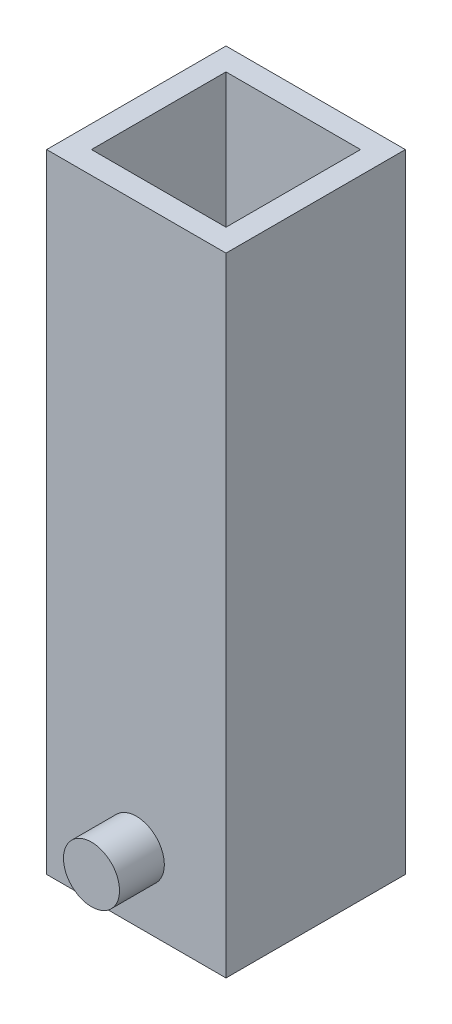
ISO-10303-21;
HEADER;
FILE_DESCRIPTION(('STEP AP214'),'2;1');
FILE_NAME('part.step','',(''),(''),'','','');
FILE_SCHEMA(('AUTOMOTIVE_DESIGN { 1 0 10303 214 1 1 1 1 }'));
ENDSEC;
DATA;
#1=APPLICATION_CONTEXT('core data for automotive mechanical design processes');
#2=APPLICATION_PROTOCOL_DEFINITION('international standard','automotive_design',2000,#1);
#3=PRODUCT_CONTEXT('',#1,'mechanical');
#4=PRODUCT('Part','Part','',(#3));
#5=PRODUCT_RELATED_PRODUCT_CATEGORY('part','',(#4));
#6=PRODUCT_DEFINITION_FORMATION('','',#4);
#7=PRODUCT_DEFINITION_CONTEXT('part definition',#1,'design');
#8=PRODUCT_DEFINITION('design','',#6,#7);
#9=PRODUCT_DEFINITION_SHAPE('','',#8);
#10=(LENGTH_UNIT() NAMED_UNIT(*) SI_UNIT(.MILLI.,.METRE.));
#11=(NAMED_UNIT(*) PLANE_ANGLE_UNIT() SI_UNIT($,.RADIAN.));
#12=(NAMED_UNIT(*) SI_UNIT($,.STERADIAN.) SOLID_ANGLE_UNIT());
#13=UNCERTAINTY_MEASURE_WITH_UNIT(LENGTH_MEASURE(1.E-05),#10,'distance_accuracy_value','');
#14=(GEOMETRIC_REPRESENTATION_CONTEXT(3) GLOBAL_UNCERTAINTY_ASSIGNED_CONTEXT((#13)) GLOBAL_UNIT_ASSIGNED_CONTEXT((#10,
#11,#12)) REPRESENTATION_CONTEXT('',''));
#15=CARTESIAN_POINT('',(0.,0.,0.));
#16=DIRECTION('',(0.,0.,1.));
#17=DIRECTION('',(1.,0.,0.));
#18=AXIS2_PLACEMENT_3D('',#15,#16,#17);
#19=CARTESIAN_POINT('',(40.,-30.,-40.));
#20=DIRECTION('',(1.,0.,0.));
#21=DIRECTION('',(0.,0.,-1.));
#22=AXIS2_PLACEMENT_3D('',#19,#20,#21);
#23=PLANE('',#22);
#24=DIRECTION('',(0.,1.,0.));
#25=VECTOR('',#24,1.);
#26=CARTESIAN_POINT('',(40.,-30.,-40.));
#27=LINE('',#26,#25);
#28=CARTESIAN_POINT('',(40.,-30.,-40.));
#29=VERTEX_POINT('',#28);
#30=CARTESIAN_POINT('',(40.,250.,-40.));
#31=VERTEX_POINT('',#30);
#32=EDGE_CURVE('E42',#29,#31,#27,.T.);
#33=ORIENTED_EDGE('',*,*,#32,.T.);
#34=DIRECTION('',(0.,0.,-1.));
#35=VECTOR('',#34,1.);
#36=CARTESIAN_POINT('',(40.,250.,-40.));
#37=LINE('',#36,#35);
#38=CARTESIAN_POINT('',(40.,250.,40.));
#39=VERTEX_POINT('',#38);
#40=EDGE_CURVE('E144',#39,#31,#37,.T.);
#41=ORIENTED_EDGE('',*,*,#40,.F.);
#42=DIRECTION('',(0.,1.,0.));
#43=VECTOR('',#42,1.);
#44=CARTESIAN_POINT('',(40.,-30.,40.));
#45=LINE('',#44,#43);
#46=CARTESIAN_POINT('',(40.,-30.,40.));
#47=VERTEX_POINT('',#46);
#48=EDGE_CURVE('E11',#47,#39,#45,.T.);
#49=ORIENTED_EDGE('',*,*,#48,.F.);
#50=DIRECTION('',(0.,0.,-1.));
#51=VECTOR('',#50,1.);
#52=CARTESIAN_POINT('',(40.,-30.,-40.));
#53=LINE('',#52,#51);
#54=EDGE_CURVE('E171',#47,#29,#53,.T.);
#55=ORIENTED_EDGE('',*,*,#54,.T.);
#56=EDGE_LOOP('',(#33,#41,#49,#55));
#57=FACE_BOUND('',#56,.T.);
#58=ADVANCED_FACE('F39',(#57),#23,.T.);
#59=CARTESIAN_POINT('',(-40.,-30.,40.));
#60=DIRECTION('',(0.,0.,1.));
#61=DIRECTION('',(1.,0.,0.));
#62=AXIS2_PLACEMENT_3D('',#59,#60,#61);
#63=PLANE('',#62);
#64=CARTESIAN_POINT('',(0.,0.,40.));
#65=DIRECTION('',(0.,0.,1.));
#66=DIRECTION('',(1.,0.,0.));
#67=AXIS2_PLACEMENT_3D('',#64,#65,#66);
#68=CIRCLE('',#67,12.5);
#69=CARTESIAN_POINT('',(12.5,0.,40.));
#70=VERTEX_POINT('',#69);
#71=EDGE_CURVE('E352',#70,#70,#68,.T.);
#72=ORIENTED_EDGE('',*,*,#71,.F.);
#73=EDGE_LOOP('',(#72));
#74=FACE_BOUND('',#73,.T.);
#75=ORIENTED_EDGE('',*,*,#48,.T.);
#76=DIRECTION('',(1.,0.,0.));
#77=VECTOR('',#76,1.);
#78=CARTESIAN_POINT('',(-40.,250.,40.));
#79=LINE('',#78,#77);
#80=CARTESIAN_POINT('',(-40.,250.,40.));
#81=VERTEX_POINT('',#80);
#82=EDGE_CURVE('E155',#81,#39,#79,.T.);
#83=ORIENTED_EDGE('',*,*,#82,.F.);
#84=DIRECTION('',(0.,1.,0.));
#85=VECTOR('',#84,1.);
#86=CARTESIAN_POINT('',(-40.,-30.,40.));
#87=LINE('',#86,#85);
#88=CARTESIAN_POINT('',(-40.,-30.,40.));
#89=VERTEX_POINT('',#88);
#90=EDGE_CURVE('E48',#89,#81,#87,.T.);
#91=ORIENTED_EDGE('',*,*,#90,.F.);
#92=DIRECTION('',(1.,0.,0.));
#93=VECTOR('',#92,1.);
#94=CARTESIAN_POINT('',(-40.,-30.,40.));
#95=LINE('',#94,#93);
#96=EDGE_CURVE('E187',#89,#47,#95,.T.);
#97=ORIENTED_EDGE('',*,*,#96,.T.);
#98=EDGE_LOOP('',(#75,#83,#91,#97));
#99=FACE_BOUND('',#98,.T.);
#100=ADVANCED_FACE('F203',(#74,#99),#63,.T.);
#101=CARTESIAN_POINT('',(-40.,-30.,-40.));
#102=DIRECTION('',(-1.,0.,0.));
#103=DIRECTION('',(0.,0.,1.));
#104=AXIS2_PLACEMENT_3D('',#101,#102,#103);
#105=PLANE('',#104);
#106=ORIENTED_EDGE('',*,*,#90,.T.);
#107=DIRECTION('',(0.,0.,1.));
#108=VECTOR('',#107,1.);
#109=CARTESIAN_POINT('',(-40.,250.,-40.));
#110=LINE('',#109,#108);
#111=CARTESIAN_POINT('',(-40.,250.,-40.));
#112=VERTEX_POINT('',#111);
#113=EDGE_CURVE('E151',#112,#81,#110,.T.);
#114=ORIENTED_EDGE('',*,*,#113,.F.);
#115=DIRECTION('',(0.,1.,0.));
#116=VECTOR('',#115,1.);
#117=CARTESIAN_POINT('',(-40.,-30.,-40.));
#118=LINE('',#117,#116);
#119=CARTESIAN_POINT('',(-40.,-30.,-40.));
#120=VERTEX_POINT('',#119);
#121=EDGE_CURVE('E192',#120,#112,#118,.T.);
#122=ORIENTED_EDGE('',*,*,#121,.F.);
#123=DIRECTION('',(0.,0.,1.));
#124=VECTOR('',#123,1.);
#125=CARTESIAN_POINT('',(-40.,-30.,-40.));
#126=LINE('',#125,#124);
#127=EDGE_CURVE('E183',#120,#89,#126,.T.);
#128=ORIENTED_EDGE('',*,*,#127,.T.);
#129=EDGE_LOOP('',(#106,#114,#122,#128));
#130=FACE_BOUND('',#129,.T.);
#131=ADVANCED_FACE('F209',(#130),#105,.T.);
#132=CARTESIAN_POINT('',(-40.,-30.,-40.));
#133=DIRECTION('',(0.,0.,-1.));
#134=DIRECTION('',(-1.,0.,0.));
#135=AXIS2_PLACEMENT_3D('',#132,#133,#134);
#136=PLANE('',#135);
#137=CARTESIAN_POINT('',(0.,0.,-40.));
#138=DIRECTION('',(0.,0.,-1.));
#139=DIRECTION('',(-1.,0.,0.));
#140=AXIS2_PLACEMENT_3D('',#137,#138,#139);
#141=CIRCLE('',#140,12.5);
#142=CARTESIAN_POINT('',(-12.5,0.,-40.));
#143=VERTEX_POINT('',#142);
#144=EDGE_CURVE('E353',#143,#143,#141,.T.);
#145=ORIENTED_EDGE('',*,*,#144,.F.);
#146=EDGE_LOOP('',(#145));
#147=FACE_BOUND('',#146,.T.);
#148=ORIENTED_EDGE('',*,*,#121,.T.);
#149=DIRECTION('',(-1.,0.,0.));
#150=VECTOR('',#149,1.);
#151=CARTESIAN_POINT('',(-40.,250.,-40.));
#152=LINE('',#151,#150);
#153=EDGE_CURVE('E147',#31,#112,#152,.T.);
#154=ORIENTED_EDGE('',*,*,#153,.F.);
#155=ORIENTED_EDGE('',*,*,#32,.F.);
#156=DIRECTION('',(-1.,0.,0.));
#157=VECTOR('',#156,1.);
#158=CARTESIAN_POINT('',(-40.,-30.,-40.));
#159=LINE('',#158,#157);
#160=EDGE_CURVE('E179',#29,#120,#159,.T.);
#161=ORIENTED_EDGE('',*,*,#160,.T.);
#162=EDGE_LOOP('',(#148,#154,#155,#161));
#163=FACE_BOUND('',#162,.T.);
#164=ADVANCED_FACE('F198',(#147,#163),#136,.T.);
#165=CARTESIAN_POINT('',(0.,-30.,0.));
#166=DIRECTION('',(0.,1.,0.));
#167=DIRECTION('',(0.,0.,1.));
#168=AXIS2_PLACEMENT_3D('',#165,#166,#167);
#169=PLANE('',#168);
#170=DIRECTION('',(1.,0.,0.));
#171=VECTOR('',#170,1.);
#172=CARTESIAN_POINT('',(-30.,-30.,30.));
#173=LINE('',#172,#171);
#174=CARTESIAN_POINT('',(-30.,-30.,30.));
#175=VERTEX_POINT('',#174);
#176=CARTESIAN_POINT('',(30.,-30.,30.));
#177=VERTEX_POINT('',#176);
#178=EDGE_CURVE('E118',#175,#177,#173,.T.);
#179=ORIENTED_EDGE('',*,*,#178,.T.);
#180=DIRECTION('',(0.,0.,-1.));
#181=VECTOR('',#180,1.);
#182=CARTESIAN_POINT('',(30.,-30.,-30.));
#183=LINE('',#182,#181);
#184=CARTESIAN_POINT('',(30.,-30.,-30.));
#185=VERTEX_POINT('',#184);
#186=EDGE_CURVE('E159',#177,#185,#183,.T.);
#187=ORIENTED_EDGE('',*,*,#186,.T.);
#188=DIRECTION('',(-1.,0.,0.));
#189=VECTOR('',#188,1.);
#190=CARTESIAN_POINT('',(-30.,-30.,-30.));
#191=LINE('',#190,#189);
#192=CARTESIAN_POINT('',(-30.,-30.,-30.));
#193=VERTEX_POINT('',#192);
#194=EDGE_CURVE('E112',#185,#193,#191,.T.);
#195=ORIENTED_EDGE('',*,*,#194,.T.);
#196=DIRECTION('',(0.,0.,1.));
#197=VECTOR('',#196,1.);
#198=CARTESIAN_POINT('',(-30.,-30.,-30.));
#199=LINE('',#198,#197);
#200=EDGE_CURVE('E56',#193,#175,#199,.T.);
#201=ORIENTED_EDGE('',*,*,#200,.T.);
#202=EDGE_LOOP('',(#179,#187,#195,#201));
#203=FACE_BOUND('',#202,.T.);
#204=ORIENTED_EDGE('',*,*,#54,.F.);
#205=ORIENTED_EDGE('',*,*,#96,.F.);
#206=ORIENTED_EDGE('',*,*,#127,.F.);
#207=ORIENTED_EDGE('',*,*,#160,.F.);
#208=EDGE_LOOP('',(#204,#205,#206,#207));
#209=FACE_BOUND('',#208,.T.);
#210=ADVANCED_FACE('F207',(#203,#209),#169,.F.);
#211=CARTESIAN_POINT('',(30.,-30.,-30.));
#212=DIRECTION('',(1.,0.,0.));
#213=DIRECTION('',(0.,0.,-1.));
#214=AXIS2_PLACEMENT_3D('',#211,#212,#213);
#215=PLANE('',#214);
#216=DIRECTION('',(0.,1.,0.));
#217=VECTOR('',#216,1.);
#218=CARTESIAN_POINT('',(30.,-30.,30.));
#219=LINE('',#218,#217);
#220=CARTESIAN_POINT('',(30.,250.,30.));
#221=VERTEX_POINT('',#220);
#222=EDGE_CURVE('E123',#177,#221,#219,.T.);
#223=ORIENTED_EDGE('',*,*,#222,.T.);
#224=DIRECTION('',(0.,0.,-1.));
#225=VECTOR('',#224,1.);
#226=CARTESIAN_POINT('',(30.,250.,-30.));
#227=LINE('',#226,#225);
#228=CARTESIAN_POINT('',(30.,250.,-30.));
#229=VERTEX_POINT('',#228);
#230=EDGE_CURVE('E121',#221,#229,#227,.T.);
#231=ORIENTED_EDGE('',*,*,#230,.T.);
#232=DIRECTION('',(0.,1.,0.));
#233=VECTOR('',#232,1.);
#234=CARTESIAN_POINT('',(30.,-30.,-30.));
#235=LINE('',#234,#233);
#236=EDGE_CURVE('E105',#185,#229,#235,.T.);
#237=ORIENTED_EDGE('',*,*,#236,.F.);
#238=ORIENTED_EDGE('',*,*,#186,.F.);
#239=EDGE_LOOP('',(#223,#231,#237,#238));
#240=FACE_BOUND('',#239,.T.);
#241=ADVANCED_FACE('F122',(#240),#215,.F.);
#242=CARTESIAN_POINT('',(-30.,-30.,30.));
#243=DIRECTION('',(0.,0.,1.));
#244=DIRECTION('',(1.,0.,0.));
#245=AXIS2_PLACEMENT_3D('',#242,#243,#244);
#246=PLANE('',#245);
#247=DIRECTION('',(0.,1.,0.));
#248=VECTOR('',#247,1.);
#249=CARTESIAN_POINT('',(-30.,-30.,30.));
#250=LINE('',#249,#248);
#251=CARTESIAN_POINT('',(-30.,250.,30.));
#252=VERTEX_POINT('',#251);
#253=EDGE_CURVE('E172',#175,#252,#250,.T.);
#254=ORIENTED_EDGE('',*,*,#253,.T.);
#255=DIRECTION('',(1.,0.,0.));
#256=VECTOR('',#255,1.);
#257=CARTESIAN_POINT('',(-30.,250.,30.));
#258=LINE('',#257,#256);
#259=EDGE_CURVE('E138',#252,#221,#258,.T.);
#260=ORIENTED_EDGE('',*,*,#259,.T.);
#261=ORIENTED_EDGE('',*,*,#222,.F.);
#262=ORIENTED_EDGE('',*,*,#178,.F.);
#263=EDGE_LOOP('',(#254,#260,#261,#262));
#264=FACE_BOUND('',#263,.T.);
#265=ADVANCED_FACE('F253',(#264),#246,.F.);
#266=CARTESIAN_POINT('',(-30.,-30.,-30.));
#267=DIRECTION('',(-1.,0.,0.));
#268=DIRECTION('',(0.,0.,1.));
#269=AXIS2_PLACEMENT_3D('',#266,#267,#268);
#270=PLANE('',#269);
#271=DIRECTION('',(0.,1.,0.));
#272=VECTOR('',#271,1.);
#273=CARTESIAN_POINT('',(-30.,-30.,-30.));
#274=LINE('',#273,#272);
#275=CARTESIAN_POINT('',(-30.,250.,-30.));
#276=VERTEX_POINT('',#275);
#277=EDGE_CURVE('E117',#193,#276,#274,.T.);
#278=ORIENTED_EDGE('',*,*,#277,.T.);
#279=DIRECTION('',(0.,0.,1.));
#280=VECTOR('',#279,1.);
#281=CARTESIAN_POINT('',(-30.,250.,-30.));
#282=LINE('',#281,#280);
#283=EDGE_CURVE('E132',#276,#252,#282,.T.);
#284=ORIENTED_EDGE('',*,*,#283,.T.);
#285=ORIENTED_EDGE('',*,*,#253,.F.);
#286=ORIENTED_EDGE('',*,*,#200,.F.);
#287=EDGE_LOOP('',(#278,#284,#285,#286));
#288=FACE_BOUND('',#287,.T.);
#289=ADVANCED_FACE('F261',(#288),#270,.F.);
#290=CARTESIAN_POINT('',(-30.,-30.,-30.));
#291=DIRECTION('',(0.,0.,-1.));
#292=DIRECTION('',(-1.,0.,0.));
#293=AXIS2_PLACEMENT_3D('',#290,#291,#292);
#294=PLANE('',#293);
#295=ORIENTED_EDGE('',*,*,#236,.T.);
#296=DIRECTION('',(-1.,0.,0.));
#297=VECTOR('',#296,1.);
#298=CARTESIAN_POINT('',(-30.,250.,-30.));
#299=LINE('',#298,#297);
#300=EDGE_CURVE('E109',#229,#276,#299,.T.);
#301=ORIENTED_EDGE('',*,*,#300,.T.);
#302=ORIENTED_EDGE('',*,*,#277,.F.);
#303=ORIENTED_EDGE('',*,*,#194,.F.);
#304=EDGE_LOOP('',(#295,#301,#302,#303));
#305=FACE_BOUND('',#304,.T.);
#306=ADVANCED_FACE('F107',(#305),#294,.F.);
#307=CARTESIAN_POINT('',(0.,250.,0.));
#308=DIRECTION('',(0.,1.,0.));
#309=DIRECTION('',(0.,0.,1.));
#310=AXIS2_PLACEMENT_3D('',#307,#308,#309);
#311=PLANE('',#310);
#312=ORIENTED_EDGE('',*,*,#40,.T.);
#313=ORIENTED_EDGE('',*,*,#153,.T.);
#314=ORIENTED_EDGE('',*,*,#113,.T.);
#315=ORIENTED_EDGE('',*,*,#82,.T.);
#316=EDGE_LOOP('',(#312,#313,#314,#315));
#317=FACE_BOUND('',#316,.T.);
#318=ORIENTED_EDGE('',*,*,#300,.F.);
#319=ORIENTED_EDGE('',*,*,#230,.F.);
#320=ORIENTED_EDGE('',*,*,#259,.F.);
#321=ORIENTED_EDGE('',*,*,#283,.F.);
#322=EDGE_LOOP('',(#318,#319,#320,#321));
#323=FACE_BOUND('',#322,.T.);
#324=ADVANCED_FACE('F130',(#317,#323),#311,.T.);
#325=CARTESIAN_POINT('',(0.,0.,60.));
#326=DIRECTION('',(0.,0.,-1.));
#327=DIRECTION('',(-1.,0.,0.));
#328=AXIS2_PLACEMENT_3D('',#325,#326,#327);
#329=CYLINDRICAL_SURFACE('',#328,12.5);
#330=CARTESIAN_POINT('',(0.,0.,60.));
#331=DIRECTION('',(0.,0.,1.));
#332=DIRECTION('',(1.,0.,0.));
#333=AXIS2_PLACEMENT_3D('',#330,#331,#332);
#334=CIRCLE('',#333,12.5);
#335=CARTESIAN_POINT('',(12.5,0.,60.));
#336=VERTEX_POINT('',#335);
#337=EDGE_CURVE('E128',#336,#336,#334,.T.);
#338=ORIENTED_EDGE('',*,*,#337,.F.);
#339=EDGE_LOOP('',(#338));
#340=FACE_BOUND('',#339,.T.);
#341=ORIENTED_EDGE('',*,*,#71,.T.);
#342=EDGE_LOOP('',(#341));
#343=FACE_BOUND('',#342,.T.);
#344=ADVANCED_FACE('F283',(#340,#343),#329,.T.);
#345=CARTESIAN_POINT('',(0.,0.,60.));
#346=DIRECTION('',(0.,0.,1.));
#347=DIRECTION('',(1.,0.,0.));
#348=AXIS2_PLACEMENT_3D('',#345,#346,#347);
#349=PLANE('',#348);
#350=ORIENTED_EDGE('',*,*,#337,.T.);
#351=EDGE_LOOP('',(#350));
#352=FACE_BOUND('',#351,.T.);
#353=ADVANCED_FACE('F290',(#352),#349,.T.);
#354=CARTESIAN_POINT('',(0.,0.,-65.));
#355=DIRECTION('',(0.,0.,1.));
#356=DIRECTION('',(1.,0.,0.));
#357=AXIS2_PLACEMENT_3D('',#354,#355,#356);
#358=CYLINDRICAL_SURFACE('',#357,12.5);
#359=CARTESIAN_POINT('',(0.,0.,-65.));
#360=DIRECTION('',(0.,0.,-1.));
#361=DIRECTION('',(-1.,0.,0.));
#362=AXIS2_PLACEMENT_3D('',#359,#360,#361);
#363=CIRCLE('',#362,12.5);
#364=CARTESIAN_POINT('',(-12.5,0.,-65.));
#365=VERTEX_POINT('',#364);
#366=EDGE_CURVE('E350',#365,#365,#363,.T.);
#367=ORIENTED_EDGE('',*,*,#366,.F.);
#368=EDGE_LOOP('',(#367));
#369=FACE_BOUND('',#368,.T.);
#370=ORIENTED_EDGE('',*,*,#144,.T.);
#371=EDGE_LOOP('',(#370));
#372=FACE_BOUND('',#371,.T.);
#373=ADVANCED_FACE('F298',(#369,#372),#358,.T.);
#374=CARTESIAN_POINT('',(0.,0.,-65.));
#375=DIRECTION('',(0.,0.,-1.));
#376=DIRECTION('',(-1.,0.,0.));
#377=AXIS2_PLACEMENT_3D('',#374,#375,#376);
#378=PLANE('',#377);
#379=ORIENTED_EDGE('',*,*,#366,.T.);
#380=EDGE_LOOP('',(#379));
#381=FACE_BOUND('',#380,.T.);
#382=ADVANCED_FACE('F306',(#381),#378,.T.);
#383=CLOSED_SHELL('',(#58,#100,#131,#164,#210,#241,#265,#289,#306,#324,#344,#353,#373,#382));
#384=MANIFOLD_SOLID_BREP('B2',#383);
#385=ADVANCED_BREP_SHAPE_REPRESENTATION('',(#18,#384),#14);
#386=SHAPE_DEFINITION_REPRESENTATION(#9,#385);
ENDSEC;
END-ISO-10303-21;
